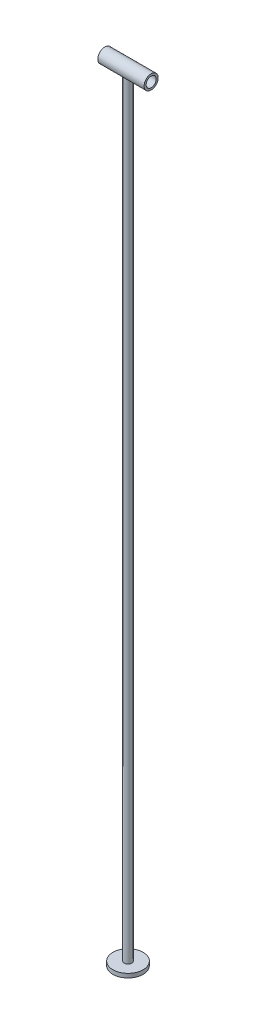
ISO-10303-21;
HEADER;
FILE_DESCRIPTION(('STEP AP214'),'2;1');
FILE_NAME('part.step','',(''),(''),'','','');
FILE_SCHEMA(('AUTOMOTIVE_DESIGN { 1 0 10303 214 1 1 1 1 }'));
ENDSEC;
DATA;
#1=APPLICATION_CONTEXT('core data for automotive mechanical design processes');
#2=APPLICATION_PROTOCOL_DEFINITION('international standard','automotive_design',2000,#1);
#3=PRODUCT_CONTEXT('',#1,'mechanical');
#4=PRODUCT('Part','Part','',(#3));
#5=PRODUCT_RELATED_PRODUCT_CATEGORY('part','',(#4));
#6=PRODUCT_DEFINITION_FORMATION('','',#4);
#7=PRODUCT_DEFINITION_CONTEXT('part definition',#1,'design');
#8=PRODUCT_DEFINITION('design','',#6,#7);
#9=PRODUCT_DEFINITION_SHAPE('','',#8);
#10=(LENGTH_UNIT() NAMED_UNIT(*) SI_UNIT(.MILLI.,.METRE.));
#11=(NAMED_UNIT(*) PLANE_ANGLE_UNIT() SI_UNIT($,.RADIAN.));
#12=(NAMED_UNIT(*) SI_UNIT($,.STERADIAN.) SOLID_ANGLE_UNIT());
#13=UNCERTAINTY_MEASURE_WITH_UNIT(LENGTH_MEASURE(1.E-05),#10,'distance_accuracy_value','');
#14=(GEOMETRIC_REPRESENTATION_CONTEXT(3) GLOBAL_UNCERTAINTY_ASSIGNED_CONTEXT((#13)) GLOBAL_UNIT_ASSIGNED_CONTEXT((#10,
#11,#12)) REPRESENTATION_CONTEXT('',''));
#15=CARTESIAN_POINT('',(0.,0.,0.));
#16=DIRECTION('',(0.,0.,1.));
#17=DIRECTION('',(1.,0.,0.));
#18=AXIS2_PLACEMENT_3D('',#15,#16,#17);
#19=CARTESIAN_POINT('',(-115.,3835.,0.));
#20=DIRECTION('',(1.,0.,0.));
#21=DIRECTION('',(0.,0.,-1.));
#22=AXIS2_PLACEMENT_3D('',#19,#20,#21);
#23=CYLINDRICAL_SURFACE('',#22,34.9999999999999);
#24=CARTESIAN_POINT('',(-115.,3835.,0.));
#25=DIRECTION('',(1.,0.,0.));
#26=DIRECTION('',(0.,0.,-1.));
#27=AXIS2_PLACEMENT_3D('',#24,#25,#26);
#28=CIRCLE('',#27,34.9999999999999);
#29=CARTESIAN_POINT('',(-115.,3835.,-34.9999999999999));
#30=VERTEX_POINT('',#29);
#31=EDGE_CURVE('E11',#30,#30,#28,.T.);
#32=ORIENTED_EDGE('',*,*,#31,.T.);
#33=EDGE_LOOP('',(#32));
#34=FACE_BOUND('',#33,.T.);
#35=CARTESIAN_POINT('',(115.,3835.,0.));
#36=DIRECTION('',(1.,0.,0.));
#37=DIRECTION('',(0.,0.,-1.));
#38=AXIS2_PLACEMENT_3D('',#35,#36,#37);
#39=CIRCLE('',#38,34.9999999999999);
#40=CARTESIAN_POINT('',(115.,3835.,-34.9999999999999));
#41=VERTEX_POINT('',#40);
#42=EDGE_CURVE('E51',#41,#41,#39,.T.);
#43=ORIENTED_EDGE('',*,*,#42,.F.);
#44=EDGE_LOOP('',(#43));
#45=FACE_BOUND('',#44,.T.);
#46=ADVANCED_FACE('F41',(#34,#45),#23,.T.);
#47=CARTESIAN_POINT('',(-115.,3835.,0.));
#48=DIRECTION('',(1.,0.,0.));
#49=DIRECTION('',(0.,0.,-1.));
#50=AXIS2_PLACEMENT_3D('',#47,#48,#49);
#51=PLANE('',#50);
#52=CARTESIAN_POINT('',(-115.,3835.,0.));
#53=DIRECTION('',(1.,0.,0.));
#54=DIRECTION('',(0.,0.,-1.));
#55=AXIS2_PLACEMENT_3D('',#52,#53,#54);
#56=CIRCLE('',#55,25.0000000000002);
#57=CARTESIAN_POINT('',(-115.,3835.,-25.0000000000002));
#58=VERTEX_POINT('',#57);
#59=EDGE_CURVE('E47',#58,#58,#56,.T.);
#60=ORIENTED_EDGE('',*,*,#59,.T.);
#61=EDGE_LOOP('',(#60));
#62=FACE_BOUND('',#61,.T.);
#63=ORIENTED_EDGE('',*,*,#31,.F.);
#64=EDGE_LOOP('',(#63));
#65=FACE_BOUND('',#64,.T.);
#66=ADVANCED_FACE('F70',(#62,#65),#51,.F.);
#67=CARTESIAN_POINT('',(-115.,3835.,0.));
#68=DIRECTION('',(1.,0.,0.));
#69=DIRECTION('',(0.,0.,-1.));
#70=AXIS2_PLACEMENT_3D('',#67,#68,#69);
#71=CYLINDRICAL_SURFACE('',#70,25.0000000000002);
#72=ORIENTED_EDGE('',*,*,#59,.F.);
#73=EDGE_LOOP('',(#72));
#74=FACE_BOUND('',#73,.T.);
#75=CARTESIAN_POINT('',(115.,3835.,0.));
#76=DIRECTION('',(1.,0.,0.));
#77=DIRECTION('',(0.,0.,-1.));
#78=AXIS2_PLACEMENT_3D('',#75,#76,#77);
#79=CIRCLE('',#78,25.0000000000002);
#80=CARTESIAN_POINT('',(115.,3835.,-25.0000000000002));
#81=VERTEX_POINT('',#80);
#82=EDGE_CURVE('E55',#81,#81,#79,.T.);
#83=ORIENTED_EDGE('',*,*,#82,.T.);
#84=EDGE_LOOP('',(#83));
#85=FACE_BOUND('',#84,.T.);
#86=ADVANCED_FACE('F61',(#74,#85),#71,.F.);
#87=CARTESIAN_POINT('',(115.,3835.,0.));
#88=DIRECTION('',(1.,0.,0.));
#89=DIRECTION('',(0.,0.,-1.));
#90=AXIS2_PLACEMENT_3D('',#87,#88,#89);
#91=PLANE('',#90);
#92=ORIENTED_EDGE('',*,*,#42,.T.);
#93=EDGE_LOOP('',(#92));
#94=FACE_BOUND('',#93,.T.);
#95=ORIENTED_EDGE('',*,*,#82,.F.);
#96=EDGE_LOOP('',(#95));
#97=FACE_BOUND('',#96,.T.);
#98=ADVANCED_FACE('F63',(#94,#97),#91,.T.);
#99=CLOSED_SHELL('',(#46,#66,#86,#98));
#100=MANIFOLD_SOLID_BREP('B2',#99);
#101=CARTESIAN_POINT('',(0.,-20.,0.));
#102=DIRECTION('',(0.,1.,0.));
#103=DIRECTION('',(0.,0.,1.));
#104=AXIS2_PLACEMENT_3D('',#101,#102,#103);
#105=CYLINDRICAL_SURFACE('',#104,75.);
#106=CARTESIAN_POINT('',(0.,-20.,0.));
#107=DIRECTION('',(0.,1.,0.));
#108=DIRECTION('',(0.,0.,1.));
#109=AXIS2_PLACEMENT_3D('',#106,#107,#108);
#110=CIRCLE('',#109,75.);
#111=CARTESIAN_POINT('',(0.,-20.,75.));
#112=VERTEX_POINT('',#111);
#113=EDGE_CURVE('E110',#112,#112,#110,.T.);
#114=ORIENTED_EDGE('',*,*,#113,.T.);
#115=EDGE_LOOP('',(#114));
#116=FACE_BOUND('',#115,.T.);
#117=CARTESIAN_POINT('',(0.,0.,0.));
#118=DIRECTION('',(0.,1.,0.));
#119=DIRECTION('',(0.,0.,1.));
#120=AXIS2_PLACEMENT_3D('',#117,#118,#119);
#121=CIRCLE('',#120,75.);
#122=CARTESIAN_POINT('',(0.,0.,75.));
#123=VERTEX_POINT('',#122);
#124=EDGE_CURVE('E106',#123,#123,#121,.T.);
#125=ORIENTED_EDGE('',*,*,#124,.F.);
#126=EDGE_LOOP('',(#125));
#127=FACE_BOUND('',#126,.T.);
#128=ADVANCED_FACE('F103',(#116,#127),#105,.T.);
#129=CARTESIAN_POINT('',(0.,-20.,0.));
#130=DIRECTION('',(0.,1.,0.));
#131=DIRECTION('',(0.,0.,1.));
#132=AXIS2_PLACEMENT_3D('',#129,#130,#131);
#133=PLANE('',#132);
#134=ORIENTED_EDGE('',*,*,#113,.F.);
#135=EDGE_LOOP('',(#134));
#136=FACE_BOUND('',#135,.T.);
#137=ADVANCED_FACE('F137',(#136),#133,.F.);
#138=CARTESIAN_POINT('',(0.,0.,0.));
#139=DIRECTION('',(0.,1.,0.));
#140=DIRECTION('',(0.,0.,1.));
#141=AXIS2_PLACEMENT_3D('',#138,#139,#140);
#142=PLANE('',#141);
#143=CARTESIAN_POINT('',(0.,0.,0.));
#144=DIRECTION('',(0.,1.,0.));
#145=DIRECTION('',(0.,0.,1.));
#146=AXIS2_PLACEMENT_3D('',#143,#144,#145);
#147=CIRCLE('',#146,18.75);
#148=CARTESIAN_POINT('',(0.,0.,18.75));
#149=VERTEX_POINT('',#148);
#150=EDGE_CURVE('E40',#149,#149,#147,.T.);
#151=ORIENTED_EDGE('',*,*,#150,.F.);
#152=EDGE_LOOP('',(#151));
#153=FACE_BOUND('',#152,.T.);
#154=ORIENTED_EDGE('',*,*,#124,.T.);
#155=EDGE_LOOP('',(#154));
#156=FACE_BOUND('',#155,.T.);
#157=ADVANCED_FACE('F133',(#153,#156),#142,.T.);
#158=CARTESIAN_POINT('',(0.,3870.001,0.));
#159=DIRECTION('',(0.,-1.,0.));
#160=DIRECTION('',(0.,0.,-1.));
#161=AXIS2_PLACEMENT_3D('',#158,#159,#160);
#162=CYLINDRICAL_SURFACE('',#161,18.75);
#163=CARTESIAN_POINT('',(0.,3805.44602395616,-18.75));
#164=CARTESIAN_POINT('',(0.483078489030136,3805.44602689294,-18.7500023519711));
#165=CARTESIAN_POINT('',(0.966130378368535,3805.43414067437,-18.7313080619849));
#166=CARTESIAN_POINT('',(1.92839661271527,3805.38707692288,-18.6568145642689));
#167=CARTESIAN_POINT('',(2.40760947441812,3805.35189078889,-18.6010016542922));
#168=CARTESIAN_POINT('',(3.35895992571335,3805.25953015883,-18.4529681470082));
#169=CARTESIAN_POINT('',(3.83108537865553,3805.20232161762,-18.360691172865));
#170=CARTESIAN_POINT('',(4.764126250635,3805.06805706291,-18.140984638598));
#171=CARTESIAN_POINT('',(5.22504240325624,3804.99100235206,-18.01355738563));
#172=CARTESIAN_POINT('',(6.13015133526575,3804.82020783964,-17.7259107545507));
#173=CARTESIAN_POINT('',(6.57442800829104,3804.72657115302,-17.5658931657045));
#174=CARTESIAN_POINT('',(7.44690963174182,3804.52519505193,-17.214159893269));
#175=CARTESIAN_POINT('',(7.87511437470672,3804.41745545549,-17.0224438006797));
#176=CARTESIAN_POINT('',(8.71356132769629,3804.19089884604,-16.6088784813843));
#177=CARTESIAN_POINT('',(9.12380579074418,3804.07208322834,-16.3870330486517));
#178=CARTESIAN_POINT('',(9.92500250920015,3803.82632985467,-15.9145598284534));
#179=CARTESIAN_POINT('',(10.3159475838782,3803.69938911532,-15.6639214416751));
#180=CARTESIAN_POINT('',(11.1133645113205,3803.42800756378,-15.1100372625726));
#181=CARTESIAN_POINT('',(11.51776201954,3803.2830522735,-14.8040540231756));
#182=CARTESIAN_POINT('',(12.2999703150198,3802.99070216343,-14.1608493331688));
#183=CARTESIAN_POINT('',(12.6777795622023,3802.84330720293,-13.8236260756528));
#184=CARTESIAN_POINT('',(13.4053942311088,3802.54955731597,-13.1192402338224));
#185=CARTESIAN_POINT('',(13.7551794991973,3802.40320320575,-12.7520564795258));
#186=CARTESIAN_POINT('',(14.4245559674524,3802.11513912616,-11.9896594887361));
#187=CARTESIAN_POINT('',(14.7441570986944,3801.97342763937,-11.5944555467938));
#188=CARTESIAN_POINT('',(15.375890673634,3801.68678943845,-10.7446222861981));
#189=CARTESIAN_POINT('',(15.6853439342752,3801.54252450623,-10.2877707392459));
#190=CARTESIAN_POINT('',(16.2643279924406,3801.26721179267,-9.34558006425944));
#191=CARTESIAN_POINT('',(16.5338560725982,3801.13616491118,-8.86023900032275));
#192=CARTESIAN_POINT('',(17.0300968574487,3800.89112779912,-7.86432568686154));
#193=CARTESIAN_POINT('',(17.2568332226698,3800.77712815003,-7.35376757863586));
#194=CARTESIAN_POINT('',(17.6649211848263,3800.56954759756,-6.31082422388647));
#195=CARTESIAN_POINT('',(17.8462784530048,3800.47596414286,-5.778441714551));
#196=CARTESIAN_POINT('',(18.1485581270734,3800.31870267576,-4.7393408735025));
#197=CARTESIAN_POINT('',(18.2731448334945,3800.25323582142,-4.23395817201531));
#198=CARTESIAN_POINT('',(18.4801284375681,3800.14394026934,-3.21230960916982));
#199=CARTESIAN_POINT('',(18.5625273882826,3800.10011051864,-2.6960442786866));
#200=CARTESIAN_POINT('',(18.6839254766529,3800.03539026178,-1.65731639140599));
#201=CARTESIAN_POINT('',(18.7229505232071,3800.01448606142,-1.13485772285135));
#202=CARTESIAN_POINT('',(18.7571021230209,3799.99619799417,-0.0881114690840705));
#203=CARTESIAN_POINT('',(18.7522319084447,3799.99881239554,0.436175978627356));
#204=CARTESIAN_POINT('',(18.701355087278,3800.02604085551,1.42970781118536));
#205=CARTESIAN_POINT('',(18.6594948139769,3800.0484373662,1.8992324895916));
#206=CARTESIAN_POINT('',(18.5407780921292,3800.11167213925,2.8325426230226));
#207=CARTESIAN_POINT('',(18.4639244859928,3800.15250890375,3.29632854104849));
#208=CARTESIAN_POINT('',(18.2761011029837,3800.2516616212,4.21503083967965));
#209=CARTESIAN_POINT('',(18.1651301606746,3800.30997817124,4.66994691672963));
#210=CARTESIAN_POINT('',(17.9102582252019,3800.44275728211,5.56803886221505));
#211=CARTESIAN_POINT('',(17.7663559771399,3800.51722045822,6.0112142825363));
#212=CARTESIAN_POINT('',(17.4451484232257,3800.6816164728,6.888397647578));
#213=CARTESIAN_POINT('',(17.2674706538733,3800.77172072844,7.32223678959242));
#214=CARTESIAN_POINT('',(16.8814234705126,3800.96484125443,8.17302152001498));
#215=CARTESIAN_POINT('',(16.6730541683526,3801.06785747773,8.58996716998058));
#216=CARTESIAN_POINT('',(16.227189709388,3801.28470319711,9.40514196598116));
#217=CARTESIAN_POINT('',(15.9896884389745,3801.3985349618,9.80336715901979));
#218=CARTESIAN_POINT('',(15.4871661830084,3801.6347391447,10.5794104513586));
#219=CARTESIAN_POINT('',(15.2221427101385,3801.75711233452,10.9572267015032));
#220=CARTESIAN_POINT('',(14.6371002430903,3802.02111089772,11.729287089204));
#221=CARTESIAN_POINT('',(14.3142282448345,3802.16341367035,12.1211408773303));
#222=CARTESIAN_POINT('',(13.6386731732035,3802.45222506731,12.8765650638491));
#223=CARTESIAN_POINT('',(13.2859882881111,3802.59873394688,13.2401337407848));
#224=CARTESIAN_POINT('',(12.5521769347586,3802.89265591437,13.9377840973877));
#225=CARTESIAN_POINT('',(12.1710250942284,3803.04006969879,14.2718388786619));
#226=CARTESIAN_POINT('',(11.5795684796887,3803.2590110247,14.7492476223629));
#227=CARTESIAN_POINT('',(11.3791201027237,3803.33163097257,14.9044437723077));
#228=CARTESIAN_POINT('',(10.9717597392144,3803.47571257352,15.2068194077808));
#229=CARTESIAN_POINT('',(10.7648457367674,3803.54717385456,15.3539963529742));
#230=CARTESIAN_POINT('',(10.100974937769,3803.77045404024,15.8061459741769));
#231=CARTESIAN_POINT('',(9.63254366689714,3803.91927314742,16.0959992866575));
#232=CARTESIAN_POINT('',(8.66910400833235,3804.20423448556,16.6347155293388));
#233=CARTESIAN_POINT('',(8.17409810818977,3804.3403778998,16.8835822872954));
#234=CARTESIAN_POINT('',(7.16053100716598,3804.59489537729,17.3377436694685));
#235=CARTESIAN_POINT('',(6.64198972342271,3804.71328411346,17.5430743317774));
#236=CARTESIAN_POINT('',(5.58447540517957,3804.92748751585,17.9077867367245));
#237=CARTESIAN_POINT('',(5.04550555565897,3805.02330568434,18.0671756089902));
#238=CARTESIAN_POINT('',(3.99585957514136,3805.18125667848,18.3265848484007));
#239=CARTESIAN_POINT('',(3.48643093522901,3805.24549030752,18.4303700754977));
#240=CARTESIAN_POINT('',(2.45816213592395,3805.34838049004,18.5954562249319));
#241=CARTESIAN_POINT('',(1.93932256091024,3805.3870386261,18.6567597759954));
#242=CARTESIAN_POINT('',(0.897455920693394,3805.43697543419,18.7357887869277));
#243=CARTESIAN_POINT('',(0.374432783303233,3805.44827731625,18.7535511888604));
#244=CARTESIAN_POINT('',(-0.671099858890839,3805.44302610193,18.7452753082323));
#245=CARTESIAN_POINT('',(-1.19360940774299,3805.42647564988,18.7192411837677));
#246=CARTESIAN_POINT('',(-2.1630106331726,3805.37038168361,18.6302969362427));
#247=CARTESIAN_POINT('',(-2.61061315336194,3805.3342332764,18.5728226163617));
#248=CARTESIAN_POINT('',(-3.49857710820354,3805.24294109532,18.4262016188236));
#249=CARTESIAN_POINT('',(-3.93893933034786,3805.18779940176,18.3370584098015));
#250=CARTESIAN_POINT('',(-4.80989123359967,3805.06027982435,18.1281025497623));
#251=CARTESIAN_POINT('',(-5.24047779600371,3804.98789652228,18.0082802568962));
#252=CARTESIAN_POINT('',(-6.08947800150488,3804.82806989427,17.7391965999495));
#253=CARTESIAN_POINT('',(-6.50789082819579,3804.740625561,17.5899332666649));
#254=CARTESIAN_POINT('',(-7.34862298532099,3804.54897446051,17.2561196002844));
#255=CARTESIAN_POINT('',(-7.77031315842598,3804.44420193411,17.0703117052198));
#256=CARTESIAN_POINT('',(-8.59674288090862,3804.22366518817,16.6694197203043));
#257=CARTESIAN_POINT('',(-9.00147520920002,3804.10789635332,16.4543233210581));
#258=CARTESIAN_POINT('',(-9.79241045078271,3803.86823615765,15.9962523566418));
#259=CARTESIAN_POINT('',(-10.178610035991,3803.74434334731,15.7532728106287));
#260=CARTESIAN_POINT('',(-10.9311346140411,3803.49124540565,15.240737591636));
#261=CARTESIAN_POINT('',(-11.297457932027,3803.36203982825,14.9711796844294));
#262=CARTESIAN_POINT('',(-12.0620046694849,3803.08159102944,14.3646358419998));
#263=CARTESIAN_POINT('',(-12.456859500917,3802.92993034027,14.0235857465587));
#264=CARTESIAN_POINT('',(-13.2169287773012,3802.62712276442,13.3096649831026));
#265=CARTESIAN_POINT('',(-13.5821406509725,3802.47597592341,12.9367915604205));
#266=CARTESIAN_POINT('',(-14.2811763522112,3802.17791145774,12.1607295446958));
#267=CARTESIAN_POINT('',(-14.6149841483422,3802.03099601944,11.7575256552554));
#268=CARTESIAN_POINT('',(-15.248925799003,3801.74511767551,10.9227936250591));
#269=CARTESIAN_POINT('',(-15.5490596403956,3801.60615477299,10.4912654732531));
#270=CARTESIAN_POINT('',(-16.1255579355402,3801.33393706431,9.58282502395309));
#271=CARTESIAN_POINT('',(-16.4003473768111,3801.20118392979,9.10475944136554));
#272=CARTESIAN_POINT('',(-16.9082016356359,3800.9518600787,8.1228510337656));
#273=CARTESIAN_POINT('',(-17.1412644681151,3800.83529013208,7.6190069838504));
#274=CARTESIAN_POINT('',(-17.5627808369344,3800.62187099665,6.58941445263521));
#275=CARTESIAN_POINT('',(-17.7512703144081,3800.52500592795,6.06368402421547));
#276=CARTESIAN_POINT('',(-18.0813244007813,3800.35390579911,4.99412570514872));
#277=CARTESIAN_POINT('',(-18.2228955737902,3800.27966757349,4.45030035779764));
#278=CARTESIAN_POINT('',(-18.4453596435495,3800.16236499336,3.40413602709198));
#279=CARTESIAN_POINT('',(-18.5308834614943,3800.116936327,2.9030429584509));
#280=CARTESIAN_POINT('',(-18.661016844893,3800.04763249081,1.89409698203283));
#281=CARTESIAN_POINT('',(-18.7056291766807,3800.02375586369,1.3862445336646));
#282=CARTESIAN_POINT('',(-18.7533055545966,3799.99823479607,0.368237963103093));
#283=CARTESIAN_POINT('',(-18.756385959755,3799.99658160195,-0.141915173658544));
#284=CARTESIAN_POINT('',(-18.7209952841837,3800.01553298275,-1.16035019841567));
#285=CARTESIAN_POINT('',(-18.6825259741523,3800.03613660916,-1.66863216522742));
#286=CARTESIAN_POINT('',(-18.5694562740761,3800.09641634205,-2.63735939899337));
#287=CARTESIAN_POINT('',(-18.4980950650029,3800.13438056849,-3.09829463525064));
#288=CARTESIAN_POINT('',(-18.3216807984239,3800.22765640391,-4.01184638793905));
#289=CARTESIAN_POINT('',(-18.2166300905406,3800.28296680311,-4.46446348217934));
#290=CARTESIAN_POINT('',(-17.9739473595039,3800.40968945771,-5.35857595898122));
#291=CARTESIAN_POINT('',(-17.836313292524,3800.48110272317,-5.8000706419547));
#292=CARTESIAN_POINT('',(-17.5298033612851,3800.63847765578,-6.66940379892557));
#293=CARTESIAN_POINT('',(-17.3609260069992,3800.72444001679,-7.09724162047065));
#294=CARTESIAN_POINT('',(-16.9865644203711,3800.91255782879,-7.95268171032967));
#295=CARTESIAN_POINT('',(-16.7799524995044,3801.01519654641,-8.37968367443426));
#296=CARTESIAN_POINT('',(-16.3364012452595,3801.2319962398,-9.21455159319357));
#297=CARTESIAN_POINT('',(-16.0994614947839,3801.34615737402,-9.62241728456239));
#298=CARTESIAN_POINT('',(-15.5968523289541,3801.58368301505,-10.417385359472));
#299=CARTESIAN_POINT('',(-15.3311744177816,3801.70705024008,-10.8044815520827));
#300=CARTESIAN_POINT('',(-14.7727259150392,3801.96049303435,-11.5563141573653));
#301=CARTESIAN_POINT('',(-14.4799525484529,3802.0905692901,-11.9210482734223));
#302=CARTESIAN_POINT('',(-13.8348603014778,3802.36953685763,-12.6660227042854));
#303=CARTESIAN_POINT('',(-13.4795394645715,3802.51891335439,-13.0434863076979));
#304=CARTESIAN_POINT('',(-12.7391979723504,3802.81910250665,-13.7674780020719));
#305=CARTESIAN_POINT('',(-12.3541750775749,3802.96991526969,-14.1140037561395));
#306=CARTESIAN_POINT('',(-11.5557722303049,3803.26931638386,-14.7748248813265));
#307=CARTESIAN_POINT('',(-11.1423606533622,3803.41790202206,-15.0890833024212));
#308=CARTESIAN_POINT('',(-10.2893782986566,3803.70865816025,-15.6831536246039));
#309=CARTESIAN_POINT('',(-9.84980897600793,3803.8508290163,-15.962967439139));
#310=CARTESIAN_POINT('',(-8.92112358679679,3804.13225927008,-16.5009038052272));
#311=CARTESIAN_POINT('',(-8.43061144918915,3804.27091260372,-16.7569421077794));
#312=CARTESIAN_POINT('',(-7.42503996198075,3804.53144298316,-17.2261171765323));
#313=CARTESIAN_POINT('',(-6.90997644663176,3804.65331716821,-17.4392466299094));
#314=CARTESIAN_POINT('',(-5.86016563153006,3804.87498262533,-17.8194186046201));
#315=CARTESIAN_POINT('',(-5.3254783902651,3804.974835632,-17.9865902982772));
#316=CARTESIAN_POINT('',(-4.23955812893318,3805.14829134379,-18.2730301725519));
#317=CARTESIAN_POINT('',(-3.68833626338467,3805.22191133272,-18.3923299005229));
#318=CARTESIAN_POINT('',(-2.61616944155589,3805.3348799016,-18.5739385614649));
#319=CARTESIAN_POINT('',(-2.09606308036751,3805.37638858999,-18.6398572487588));
#320=CARTESIAN_POINT('',(-1.05062743841471,3805.43195945442,-18.7278873817805));
#321=CARTESIAN_POINT('',(-0.525297993047259,3805.44602076271,-18.7499974424742));
#322=CARTESIAN_POINT('',(0.,3805.44602395616,-18.75));
#323=B_SPLINE_CURVE_WITH_KNOTS('',3,(#163,#164,#165,#166,#167,#168,#169,#170,#171,#172,#173,
#174,#175,#176,#177,#178,#179,#180,#181,#182,#183,#184,#185,#186,#187,#188,#189,#190,#191,#192,
#193,#194,#195,#196,#197,#198,#199,#200,#201,#202,#203,#204,#205,#206,#207,#208,#209,#210,#211,
#212,#213,#214,#215,#216,#217,#218,#219,#220,#221,#222,#223,#224,#225,#226,#227,#228,#229,#230,
#231,#232,#233,#234,#235,#236,#237,#238,#239,#240,#241,#242,#243,#244,#245,#246,#247,#248,#249,
#250,#251,#252,#253,#254,#255,#256,#257,#258,#259,#260,#261,#262,#263,#264,#265,#266,#267,#268,
#269,#270,#271,#272,#273,#274,#275,#276,#277,#278,#279,#280,#281,#282,#283,#284,#285,#286,#287,
#288,#289,#290,#291,#292,#293,#294,#295,#296,#297,#298,#299,#300,#301,#302,#303,#304,#305,#306,
#307,#308,#309,#310,#311,#312,#313,#314,#315,#316,#317,#318,#319,#320,#321,#322),.UNSPECIFIED.,
.T.,.F.,(4,2,2,2,2,2,2,2,2,2,2,2,2,2,2,2,2,2,2,2,2,2,2,2,2,2,2,2,2,2,2,2,2,2,2,2,2,2,2,2,2,2,2,
2,2,2,2,2,2,2,2,2,2,2,2,2,2,2,2,2,2,2,2,2,2,2,2,2,2,2,2,2,2,2,2,2,2,2,2,4),(0.,1.44868795256949,
2.89791098177755,4.34938346677195,5.800760704253,7.24341068629247,8.68607928402862,
10.1285663849092,11.5715862086115,13.1522101414949,14.7329255539863,16.3147677308897,
17.8960876293366,19.6048877203425,21.3138040614148,23.0217727169596,24.7295278127486,
26.3011943433629,27.8727843817509,29.4434351436821,31.0139702539555,32.428048910013,
33.8420127249126,35.2560248456918,36.670090858572,38.1007648500229,39.5314336278347,
40.962403159856,42.3935021283837,43.973720288047,45.5540345460744,47.1357745265095,
47.9267049146826,48.7178844153627,50.4273536162394,52.1366630782446,53.8445520443996,
55.5521758233228,57.1213923941523,58.6905118546546,60.2582995495347,61.8259384051238,
63.1825505885729,64.5390142305743,65.8959047075515,67.2528859727919,68.6692019048665,
70.086114935222,71.5032814677933,72.9205672317754,74.5488259114556,76.1772256784707,
77.8064522655012,79.4356794881424,81.1348971318696,82.8341955916099,84.5321191364805,
86.2298050328336,87.7588309605166,89.2877534916108,90.8160737770877,92.3443289336601,
93.7466277051399,95.148828696703,96.5511176661543,97.9534735295621,99.4079743963249,
100.862495268936,102.31744732063,103.772548548386,105.389255122384,107.006083711359,
108.624743587765,110.243313504686,111.952280258524,113.661538020234,115.365941320275,
117.069219576348,118.64446838839,120.219767002005),.UNSPECIFIED.);
#324=CARTESIAN_POINT('',(0.,3805.44602395616,-18.75));
#325=VERTEX_POINT('',#324);
#326=EDGE_CURVE('E116',#325,#325,#323,.T.);
#327=ORIENTED_EDGE('',*,*,#326,.T.);
#328=EDGE_LOOP('',(#327));
#329=FACE_BOUND('',#328,.T.);
#330=ORIENTED_EDGE('',*,*,#150,.T.);
#331=EDGE_LOOP('',(#330));
#332=FACE_BOUND('',#331,.T.);
#333=ADVANCED_FACE('F123',(#329,#332),#162,.T.);
#334=CARTESIAN_POINT('',(-115.,3835.,0.));
#335=DIRECTION('',(1.,0.,0.));
#336=DIRECTION('',(0.,0.,-1.));
#337=AXIS2_PLACEMENT_3D('',#334,#335,#336);
#338=CYLINDRICAL_SURFACE('',#337,34.9999999999999);
#339=ORIENTED_EDGE('',*,*,#326,.F.);
#340=EDGE_LOOP('',(#339));
#341=FACE_BOUND('',#340,.T.);
#342=ADVANCED_FACE('F126',(#341),#338,.F.);
#343=CLOSED_SHELL('',(#128,#137,#157,#333,#342));
#344=MANIFOLD_SOLID_BREP('B6',#343);
#345=ADVANCED_BREP_SHAPE_REPRESENTATION('',(#18,#100,#344),#14);
#346=SHAPE_DEFINITION_REPRESENTATION(#9,#345);
ENDSEC;
END-ISO-10303-21;
